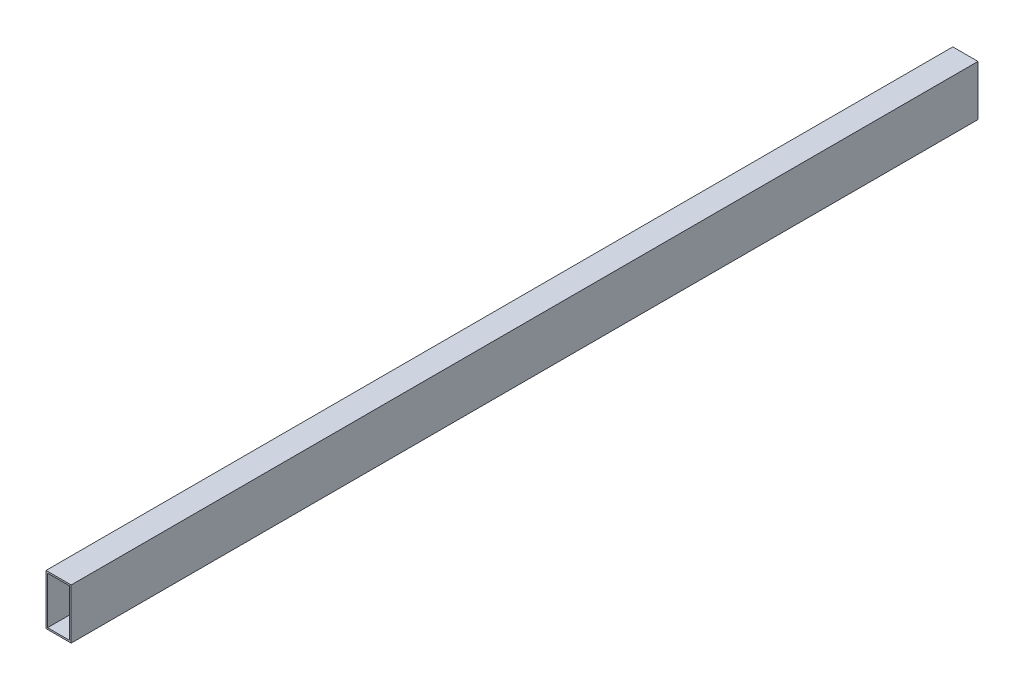
ISO-10303-21;
HEADER;
FILE_DESCRIPTION(('STEP AP214'),'2;1');
FILE_NAME('part.step','',(''),(''),'','','');
FILE_SCHEMA(('AUTOMOTIVE_DESIGN { 1 0 10303 214 1 1 1 1 }'));
ENDSEC;
DATA;
#1=APPLICATION_CONTEXT('core data for automotive mechanical design processes');
#2=APPLICATION_PROTOCOL_DEFINITION('international standard','automotive_design',2000,#1);
#3=PRODUCT_CONTEXT('',#1,'mechanical');
#4=PRODUCT('Part','Part','',(#3));
#5=PRODUCT_RELATED_PRODUCT_CATEGORY('part','',(#4));
#6=PRODUCT_DEFINITION_FORMATION('','',#4);
#7=PRODUCT_DEFINITION_CONTEXT('part definition',#1,'design');
#8=PRODUCT_DEFINITION('design','',#6,#7);
#9=PRODUCT_DEFINITION_SHAPE('','',#8);
#10=(LENGTH_UNIT() NAMED_UNIT(*) SI_UNIT(.MILLI.,.METRE.));
#11=(NAMED_UNIT(*) PLANE_ANGLE_UNIT() SI_UNIT($,.RADIAN.));
#12=(NAMED_UNIT(*) SI_UNIT($,.STERADIAN.) SOLID_ANGLE_UNIT());
#13=UNCERTAINTY_MEASURE_WITH_UNIT(LENGTH_MEASURE(1.E-05),#10,'distance_accuracy_value','');
#14=(GEOMETRIC_REPRESENTATION_CONTEXT(3) GLOBAL_UNCERTAINTY_ASSIGNED_CONTEXT((#13)) GLOBAL_UNIT_ASSIGNED_CONTEXT((#10,
#11,#12)) REPRESENTATION_CONTEXT('',''));
#15=CARTESIAN_POINT('',(0.,0.,0.));
#16=DIRECTION('',(0.,0.,1.));
#17=DIRECTION('',(1.,0.,0.));
#18=AXIS2_PLACEMENT_3D('',#15,#16,#17);
#19=CARTESIAN_POINT('',(12.7,-25.4,-914.4));
#20=DIRECTION('',(1.,0.,0.));
#21=DIRECTION('',(0.,0.,-1.));
#22=AXIS2_PLACEMENT_3D('',#19,#20,#21);
#23=PLANE('',#22);
#24=DIRECTION('',(0.,1.,0.));
#25=VECTOR('',#24,1.);
#26=CARTESIAN_POINT('',(12.7,-25.4,0.));
#27=LINE('',#26,#25);
#28=CARTESIAN_POINT('',(12.7,-25.4,0.));
#29=VERTEX_POINT('',#28);
#30=CARTESIAN_POINT('',(12.7,25.4,0.));
#31=VERTEX_POINT('',#30);
#32=EDGE_CURVE('E131',#29,#31,#27,.T.);
#33=ORIENTED_EDGE('',*,*,#32,.F.);
#34=DIRECTION('',(0.,0.,1.));
#35=VECTOR('',#34,1.);
#36=CARTESIAN_POINT('',(12.7,-25.4,-914.4));
#37=LINE('',#36,#35);
#38=CARTESIAN_POINT('',(12.7,-25.4,-914.4));
#39=VERTEX_POINT('',#38);
#40=EDGE_CURVE('E11',#39,#29,#37,.T.);
#41=ORIENTED_EDGE('',*,*,#40,.F.);
#42=DIRECTION('',(0.,1.,0.));
#43=VECTOR('',#42,1.);
#44=CARTESIAN_POINT('',(12.7,-25.4,-914.4));
#45=LINE('',#44,#43);
#46=CARTESIAN_POINT('',(12.7,25.4,-914.4));
#47=VERTEX_POINT('',#46);
#48=EDGE_CURVE('E135',#39,#47,#45,.T.);
#49=ORIENTED_EDGE('',*,*,#48,.T.);
#50=DIRECTION('',(0.,0.,1.));
#51=VECTOR('',#50,1.);
#52=CARTESIAN_POINT('',(12.7,25.4,-914.4));
#53=LINE('',#52,#51);
#54=EDGE_CURVE('E36',#47,#31,#53,.T.);
#55=ORIENTED_EDGE('',*,*,#54,.T.);
#56=EDGE_LOOP('',(#33,#41,#49,#55));
#57=FACE_BOUND('',#56,.T.);
#58=ADVANCED_FACE('F33',(#57),#23,.T.);
#59=CARTESIAN_POINT('',(-12.7,-25.4,-914.4));
#60=DIRECTION('',(0.,-1.,0.));
#61=DIRECTION('',(0.,0.,-1.));
#62=AXIS2_PLACEMENT_3D('',#59,#60,#61);
#63=PLANE('',#62);
#64=DIRECTION('',(1.,0.,0.));
#65=VECTOR('',#64,1.);
#66=CARTESIAN_POINT('',(-12.7,-25.4,0.));
#67=LINE('',#66,#65);
#68=CARTESIAN_POINT('',(-12.7,-25.4,0.));
#69=VERTEX_POINT('',#68);
#70=EDGE_CURVE('E139',#69,#29,#67,.T.);
#71=ORIENTED_EDGE('',*,*,#70,.F.);
#72=DIRECTION('',(0.,0.,1.));
#73=VECTOR('',#72,1.);
#74=CARTESIAN_POINT('',(-12.7,-25.4,-914.4));
#75=LINE('',#74,#73);
#76=CARTESIAN_POINT('',(-12.7,-25.4,-914.4));
#77=VERTEX_POINT('',#76);
#78=EDGE_CURVE('E41',#77,#69,#75,.T.);
#79=ORIENTED_EDGE('',*,*,#78,.F.);
#80=DIRECTION('',(1.,0.,0.));
#81=VECTOR('',#80,1.);
#82=CARTESIAN_POINT('',(-12.7,-25.4,-914.4));
#83=LINE('',#82,#81);
#84=EDGE_CURVE('E145',#77,#39,#83,.T.);
#85=ORIENTED_EDGE('',*,*,#84,.T.);
#86=ORIENTED_EDGE('',*,*,#40,.T.);
#87=EDGE_LOOP('',(#71,#79,#85,#86));
#88=FACE_BOUND('',#87,.T.);
#89=ADVANCED_FACE('F171',(#88),#63,.T.);
#90=CARTESIAN_POINT('',(-12.7,-25.4,-914.4));
#91=DIRECTION('',(-1.,0.,0.));
#92=DIRECTION('',(0.,0.,1.));
#93=AXIS2_PLACEMENT_3D('',#90,#91,#92);
#94=PLANE('',#93);
#95=DIRECTION('',(0.,-1.,0.));
#96=VECTOR('',#95,1.);
#97=CARTESIAN_POINT('',(-12.7,-25.4,0.));
#98=LINE('',#97,#96);
#99=CARTESIAN_POINT('',(-12.7,25.4,0.));
#100=VERTEX_POINT('',#99);
#101=EDGE_CURVE('E153',#100,#69,#98,.T.);
#102=ORIENTED_EDGE('',*,*,#101,.F.);
#103=DIRECTION('',(0.,0.,1.));
#104=VECTOR('',#103,1.);
#105=CARTESIAN_POINT('',(-12.7,25.4,-914.4));
#106=LINE('',#105,#104);
#107=CARTESIAN_POINT('',(-12.7,25.4,-914.4));
#108=VERTEX_POINT('',#107);
#109=EDGE_CURVE('E158',#108,#100,#106,.T.);
#110=ORIENTED_EDGE('',*,*,#109,.F.);
#111=DIRECTION('',(0.,-1.,0.));
#112=VECTOR('',#111,1.);
#113=CARTESIAN_POINT('',(-12.7,-25.4,-914.4));
#114=LINE('',#113,#112);
#115=EDGE_CURVE('E142',#108,#77,#114,.T.);
#116=ORIENTED_EDGE('',*,*,#115,.T.);
#117=ORIENTED_EDGE('',*,*,#78,.T.);
#118=EDGE_LOOP('',(#102,#110,#116,#117));
#119=FACE_BOUND('',#118,.T.);
#120=ADVANCED_FACE('F175',(#119),#94,.T.);
#121=CARTESIAN_POINT('',(-12.7,25.4,-914.4));
#122=DIRECTION('',(0.,1.,0.));
#123=DIRECTION('',(0.,0.,1.));
#124=AXIS2_PLACEMENT_3D('',#121,#122,#123);
#125=PLANE('',#124);
#126=DIRECTION('',(-1.,0.,0.));
#127=VECTOR('',#126,1.);
#128=CARTESIAN_POINT('',(-12.7,25.4,0.));
#129=LINE('',#128,#127);
#130=EDGE_CURVE('E150',#31,#100,#129,.T.);
#131=ORIENTED_EDGE('',*,*,#130,.F.);
#132=ORIENTED_EDGE('',*,*,#54,.F.);
#133=DIRECTION('',(-1.,0.,0.));
#134=VECTOR('',#133,1.);
#135=CARTESIAN_POINT('',(-12.7,25.4,-914.4));
#136=LINE('',#135,#134);
#137=EDGE_CURVE('E138',#47,#108,#136,.T.);
#138=ORIENTED_EDGE('',*,*,#137,.T.);
#139=ORIENTED_EDGE('',*,*,#109,.T.);
#140=EDGE_LOOP('',(#131,#132,#138,#139));
#141=FACE_BOUND('',#140,.T.);
#142=ADVANCED_FACE('F166',(#141),#125,.T.);
#143=CARTESIAN_POINT('',(0.,0.,-914.4));
#144=DIRECTION('',(0.,0.,-1.));
#145=DIRECTION('',(-1.,0.,0.));
#146=AXIS2_PLACEMENT_3D('',#143,#144,#145);
#147=PLANE('',#146);
#148=DIRECTION('',(1.,0.,0.));
#149=VECTOR('',#148,1.);
#150=CARTESIAN_POINT('',(-11.0998,-23.7998,-914.4));
#151=LINE('',#150,#149);
#152=CARTESIAN_POINT('',(-11.0998,-23.7998,-914.4));
#153=VERTEX_POINT('',#152);
#154=CARTESIAN_POINT('',(11.0998,-23.7998,-914.4));
#155=VERTEX_POINT('',#154);
#156=EDGE_CURVE('E100',#153,#155,#151,.T.);
#157=ORIENTED_EDGE('',*,*,#156,.T.);
#158=DIRECTION('',(0.,1.,0.));
#159=VECTOR('',#158,1.);
#160=CARTESIAN_POINT('',(11.0998,-23.7998,-914.4));
#161=LINE('',#160,#159);
#162=CARTESIAN_POINT('',(11.0998,23.7998,-914.4));
#163=VERTEX_POINT('',#162);
#164=EDGE_CURVE('E109',#155,#163,#161,.T.);
#165=ORIENTED_EDGE('',*,*,#164,.T.);
#166=DIRECTION('',(-1.,0.,0.));
#167=VECTOR('',#166,1.);
#168=CARTESIAN_POINT('',(-11.0998,23.7998,-914.4));
#169=LINE('',#168,#167);
#170=CARTESIAN_POINT('',(-11.0998,23.7998,-914.4));
#171=VERTEX_POINT('',#170);
#172=EDGE_CURVE('E49',#163,#171,#169,.T.);
#173=ORIENTED_EDGE('',*,*,#172,.T.);
#174=DIRECTION('',(0.,-1.,0.));
#175=VECTOR('',#174,1.);
#176=CARTESIAN_POINT('',(-11.0998,-23.7998,-914.4));
#177=LINE('',#176,#175);
#178=EDGE_CURVE('E106',#171,#153,#177,.T.);
#179=ORIENTED_EDGE('',*,*,#178,.T.);
#180=EDGE_LOOP('',(#157,#165,#173,#179));
#181=FACE_BOUND('',#180,.T.);
#182=ORIENTED_EDGE('',*,*,#48,.F.);
#183=ORIENTED_EDGE('',*,*,#84,.F.);
#184=ORIENTED_EDGE('',*,*,#115,.F.);
#185=ORIENTED_EDGE('',*,*,#137,.F.);
#186=EDGE_LOOP('',(#182,#183,#184,#185));
#187=FACE_BOUND('',#186,.T.);
#188=ADVANCED_FACE('F113',(#181,#187),#147,.T.);
#189=CARTESIAN_POINT('',(0.,0.,0.));
#190=DIRECTION('',(0.,0.,-1.));
#191=DIRECTION('',(-1.,0.,0.));
#192=AXIS2_PLACEMENT_3D('',#189,#190,#191);
#193=PLANE('',#192);
#194=DIRECTION('',(0.,1.,0.));
#195=VECTOR('',#194,1.);
#196=CARTESIAN_POINT('',(11.0998,-23.7998,0.));
#197=LINE('',#196,#195);
#198=CARTESIAN_POINT('',(11.0998,-23.7998,0.));
#199=VERTEX_POINT('',#198);
#200=CARTESIAN_POINT('',(11.0998,23.7998,0.));
#201=VERTEX_POINT('',#200);
#202=EDGE_CURVE('E125',#199,#201,#197,.T.);
#203=ORIENTED_EDGE('',*,*,#202,.F.);
#204=DIRECTION('',(1.,0.,0.));
#205=VECTOR('',#204,1.);
#206=CARTESIAN_POINT('',(-11.0998,-23.7998,0.));
#207=LINE('',#206,#205);
#208=CARTESIAN_POINT('',(-11.0998,-23.7998,0.));
#209=VERTEX_POINT('',#208);
#210=EDGE_CURVE('E57',#209,#199,#207,.T.);
#211=ORIENTED_EDGE('',*,*,#210,.F.);
#212=DIRECTION('',(0.,-1.,0.));
#213=VECTOR('',#212,1.);
#214=CARTESIAN_POINT('',(-11.0998,-23.7998,0.));
#215=LINE('',#214,#213);
#216=CARTESIAN_POINT('',(-11.0998,23.7998,0.));
#217=VERTEX_POINT('',#216);
#218=EDGE_CURVE('E116',#217,#209,#215,.T.);
#219=ORIENTED_EDGE('',*,*,#218,.F.);
#220=DIRECTION('',(-1.,0.,0.));
#221=VECTOR('',#220,1.);
#222=CARTESIAN_POINT('',(-11.0998,23.7998,0.));
#223=LINE('',#222,#221);
#224=EDGE_CURVE('E119',#201,#217,#223,.T.);
#225=ORIENTED_EDGE('',*,*,#224,.F.);
#226=EDGE_LOOP('',(#203,#211,#219,#225));
#227=FACE_BOUND('',#226,.T.);
#228=ORIENTED_EDGE('',*,*,#32,.T.);
#229=ORIENTED_EDGE('',*,*,#130,.T.);
#230=ORIENTED_EDGE('',*,*,#101,.T.);
#231=ORIENTED_EDGE('',*,*,#70,.T.);
#232=EDGE_LOOP('',(#228,#229,#230,#231));
#233=FACE_BOUND('',#232,.T.);
#234=ADVANCED_FACE('F168',(#227,#233),#193,.F.);
#235=CARTESIAN_POINT('',(-11.0998,-23.7998,-914.4));
#236=DIRECTION('',(0.,-1.,0.));
#237=DIRECTION('',(0.,0.,-1.));
#238=AXIS2_PLACEMENT_3D('',#235,#236,#237);
#239=PLANE('',#238);
#240=ORIENTED_EDGE('',*,*,#210,.T.);
#241=DIRECTION('',(0.,0.,1.));
#242=VECTOR('',#241,1.);
#243=CARTESIAN_POINT('',(11.0998,-23.7998,-914.4));
#244=LINE('',#243,#242);
#245=EDGE_CURVE('E96',#155,#199,#244,.T.);
#246=ORIENTED_EDGE('',*,*,#245,.F.);
#247=ORIENTED_EDGE('',*,*,#156,.F.);
#248=DIRECTION('',(0.,0.,1.));
#249=VECTOR('',#248,1.);
#250=CARTESIAN_POINT('',(-11.0998,-23.7998,-914.4));
#251=LINE('',#250,#249);
#252=EDGE_CURVE('E129',#153,#209,#251,.T.);
#253=ORIENTED_EDGE('',*,*,#252,.T.);
#254=EDGE_LOOP('',(#240,#246,#247,#253));
#255=FACE_BOUND('',#254,.T.);
#256=ADVANCED_FACE('F98',(#255),#239,.F.);
#257=CARTESIAN_POINT('',(-11.0998,-23.7998,-914.4));
#258=DIRECTION('',(-1.,0.,0.));
#259=DIRECTION('',(0.,0.,1.));
#260=AXIS2_PLACEMENT_3D('',#257,#258,#259);
#261=PLANE('',#260);
#262=ORIENTED_EDGE('',*,*,#218,.T.);
#263=ORIENTED_EDGE('',*,*,#252,.F.);
#264=ORIENTED_EDGE('',*,*,#178,.F.);
#265=DIRECTION('',(0.,0.,1.));
#266=VECTOR('',#265,1.);
#267=CARTESIAN_POINT('',(-11.0998,23.7998,-914.4));
#268=LINE('',#267,#266);
#269=EDGE_CURVE('E132',#171,#217,#268,.T.);
#270=ORIENTED_EDGE('',*,*,#269,.T.);
#271=EDGE_LOOP('',(#262,#263,#264,#270));
#272=FACE_BOUND('',#271,.T.);
#273=ADVANCED_FACE('F226',(#272),#261,.F.);
#274=CARTESIAN_POINT('',(-11.0998,23.7998,-914.4));
#275=DIRECTION('',(0.,1.,0.));
#276=DIRECTION('',(-1.,0.,0.));
#277=AXIS2_PLACEMENT_3D('',#274,#275,#276);
#278=PLANE('',#277);
#279=ORIENTED_EDGE('',*,*,#224,.T.);
#280=ORIENTED_EDGE('',*,*,#269,.F.);
#281=ORIENTED_EDGE('',*,*,#172,.F.);
#282=DIRECTION('',(0.,0.,1.));
#283=VECTOR('',#282,1.);
#284=CARTESIAN_POINT('',(11.0998,23.7998,-914.4));
#285=LINE('',#284,#283);
#286=EDGE_CURVE('E105',#163,#201,#285,.T.);
#287=ORIENTED_EDGE('',*,*,#286,.T.);
#288=EDGE_LOOP('',(#279,#280,#281,#287));
#289=FACE_BOUND('',#288,.T.);
#290=ADVANCED_FACE('F235',(#289),#278,.F.);
#291=CARTESIAN_POINT('',(11.0998,-23.7998,-914.4));
#292=DIRECTION('',(1.,0.,0.));
#293=DIRECTION('',(0.,0.,-1.));
#294=AXIS2_PLACEMENT_3D('',#291,#292,#293);
#295=PLANE('',#294);
#296=ORIENTED_EDGE('',*,*,#202,.T.);
#297=ORIENTED_EDGE('',*,*,#286,.F.);
#298=ORIENTED_EDGE('',*,*,#164,.F.);
#299=ORIENTED_EDGE('',*,*,#245,.T.);
#300=EDGE_LOOP('',(#296,#297,#298,#299));
#301=FACE_BOUND('',#300,.T.);
#302=ADVANCED_FACE('F110',(#301),#295,.F.);
#303=CLOSED_SHELL('',(#58,#89,#120,#142,#188,#234,#256,#273,#290,#302));
#304=MANIFOLD_SOLID_BREP('B2',#303);
#305=ADVANCED_BREP_SHAPE_REPRESENTATION('',(#18,#304),#14);
#306=SHAPE_DEFINITION_REPRESENTATION(#9,#305);
ENDSEC;
END-ISO-10303-21;
